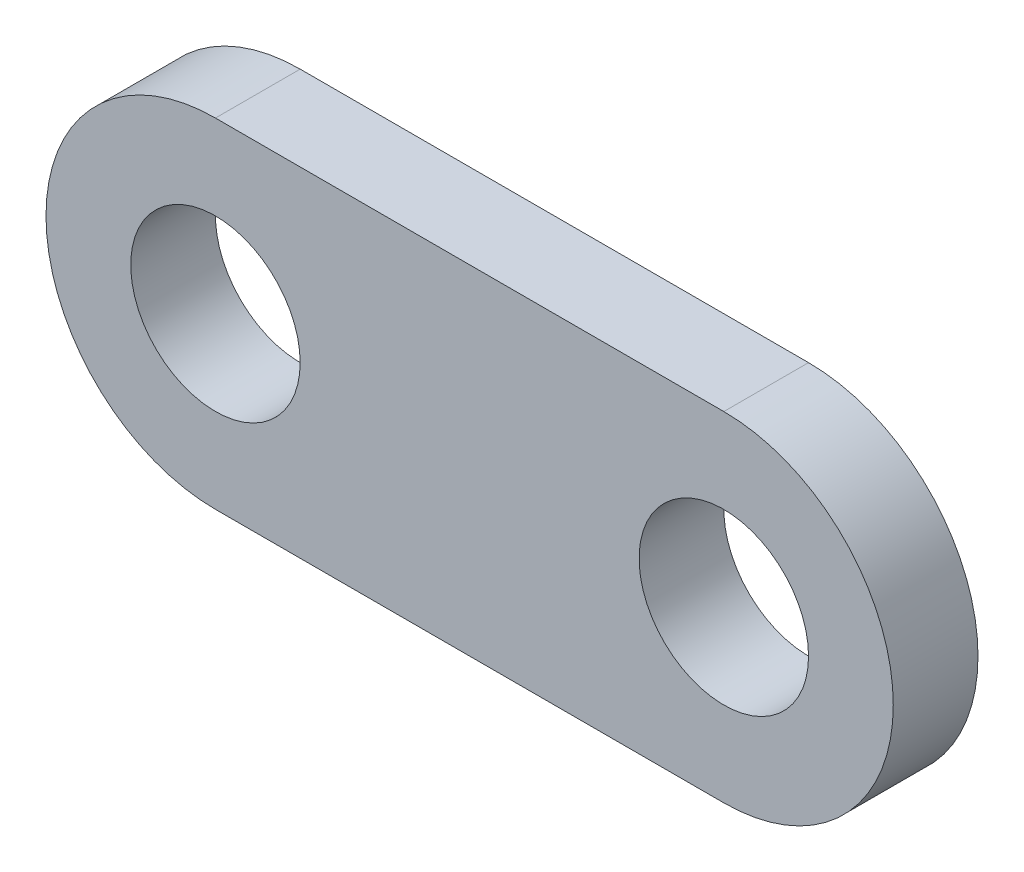
ISO-10303-21;
HEADER;
FILE_DESCRIPTION(('STEP AP214'),'2;1');
FILE_NAME('part.step','',(''),(''),'','','');
FILE_SCHEMA(('AUTOMOTIVE_DESIGN { 1 0 10303 214 1 1 1 1 }'));
ENDSEC;
DATA;
#1=APPLICATION_CONTEXT('core data for automotive mechanical design processes');
#2=APPLICATION_PROTOCOL_DEFINITION('international standard','automotive_design',2000,#1);
#3=PRODUCT_CONTEXT('',#1,'mechanical');
#4=PRODUCT('Part','Part','',(#3));
#5=PRODUCT_RELATED_PRODUCT_CATEGORY('part','',(#4));
#6=PRODUCT_DEFINITION_FORMATION('','',#4);
#7=PRODUCT_DEFINITION_CONTEXT('part definition',#1,'design');
#8=PRODUCT_DEFINITION('design','',#6,#7);
#9=PRODUCT_DEFINITION_SHAPE('','',#8);
#10=(LENGTH_UNIT() NAMED_UNIT(*) SI_UNIT(.MILLI.,.METRE.));
#11=(NAMED_UNIT(*) PLANE_ANGLE_UNIT() SI_UNIT($,.RADIAN.));
#12=(NAMED_UNIT(*) SI_UNIT($,.STERADIAN.) SOLID_ANGLE_UNIT());
#13=UNCERTAINTY_MEASURE_WITH_UNIT(LENGTH_MEASURE(1.E-05),#10,'distance_accuracy_value','');
#14=(GEOMETRIC_REPRESENTATION_CONTEXT(3) GLOBAL_UNCERTAINTY_ASSIGNED_CONTEXT((#13)) GLOBAL_UNIT_ASSIGNED_CONTEXT((#10,
#11,#12)) REPRESENTATION_CONTEXT('',''));
#15=CARTESIAN_POINT('',(0.,0.,0.));
#16=DIRECTION('',(0.,0.,1.));
#17=DIRECTION('',(1.,0.,0.));
#18=AXIS2_PLACEMENT_3D('',#15,#16,#17);
#19=CARTESIAN_POINT('',(0.,-9.99999999999999,5.));
#20=DIRECTION('',(0.,1.,0.));
#21=DIRECTION('',(0.,0.,1.));
#22=AXIS2_PLACEMENT_3D('',#19,#20,#21);
#23=PLANE('',#22);
#24=DIRECTION('',(1.,0.,0.));
#25=VECTOR('',#24,1.);
#26=CARTESIAN_POINT('',(0.,-9.99999999999999,0.));
#27=LINE('',#26,#25);
#28=CARTESIAN_POINT('',(0.,-9.99999999999999,0.));
#29=VERTEX_POINT('',#28);
#30=CARTESIAN_POINT('',(30.,-9.99999999999999,0.));
#31=VERTEX_POINT('',#30);
#32=EDGE_CURVE('E104',#29,#31,#27,.T.);
#33=ORIENTED_EDGE('',*,*,#32,.T.);
#34=DIRECTION('',(0.,0.,-1.));
#35=VECTOR('',#34,1.);
#36=CARTESIAN_POINT('',(30.,-9.99999999999999,5.));
#37=LINE('',#36,#35);
#38=CARTESIAN_POINT('',(30.,-9.99999999999999,5.));
#39=VERTEX_POINT('',#38);
#40=EDGE_CURVE('E11',#39,#31,#37,.T.);
#41=ORIENTED_EDGE('',*,*,#40,.F.);
#42=DIRECTION('',(1.,0.,0.));
#43=VECTOR('',#42,1.);
#44=CARTESIAN_POINT('',(0.,-9.99999999999999,5.));
#45=LINE('',#44,#43);
#46=CARTESIAN_POINT('',(0.,-9.99999999999999,5.));
#47=VERTEX_POINT('',#46);
#48=EDGE_CURVE('E83',#47,#39,#45,.T.);
#49=ORIENTED_EDGE('',*,*,#48,.F.);
#50=DIRECTION('',(0.,0.,-1.));
#51=VECTOR('',#50,1.);
#52=CARTESIAN_POINT('',(0.,-9.99999999999999,5.));
#53=LINE('',#52,#51);
#54=EDGE_CURVE('E94',#47,#29,#53,.T.);
#55=ORIENTED_EDGE('',*,*,#54,.T.);
#56=EDGE_LOOP('',(#33,#41,#49,#55));
#57=FACE_BOUND('',#56,.T.);
#58=ADVANCED_FACE('F35',(#57),#23,.F.);
#59=CARTESIAN_POINT('',(30.,0.,5.));
#60=DIRECTION('',(0.,0.,-1.));
#61=DIRECTION('',(-1.,0.,0.));
#62=AXIS2_PLACEMENT_3D('',#59,#60,#61);
#63=CYLINDRICAL_SURFACE('',#62,10.);
#64=CARTESIAN_POINT('',(30.,0.,0.));
#65=DIRECTION('',(0.,0.,1.));
#66=DIRECTION('',(1.,0.,0.));
#67=AXIS2_PLACEMENT_3D('',#64,#65,#66);
#68=CIRCLE('',#67,10.);
#69=CARTESIAN_POINT('',(30.,10.,0.));
#70=VERTEX_POINT('',#69);
#71=EDGE_CURVE('E88',#31,#70,#68,.T.);
#72=ORIENTED_EDGE('',*,*,#71,.T.);
#73=DIRECTION('',(0.,0.,-1.));
#74=VECTOR('',#73,1.);
#75=CARTESIAN_POINT('',(30.,10.,5.));
#76=LINE('',#75,#74);
#77=CARTESIAN_POINT('',(30.,10.,5.));
#78=VERTEX_POINT('',#77);
#79=EDGE_CURVE('E44',#78,#70,#76,.T.);
#80=ORIENTED_EDGE('',*,*,#79,.F.);
#81=CARTESIAN_POINT('',(30.,0.,5.));
#82=DIRECTION('',(0.,0.,1.));
#83=DIRECTION('',(1.,0.,0.));
#84=AXIS2_PLACEMENT_3D('',#81,#82,#83);
#85=CIRCLE('',#84,10.);
#86=EDGE_CURVE('E78',#39,#78,#85,.T.);
#87=ORIENTED_EDGE('',*,*,#86,.F.);
#88=ORIENTED_EDGE('',*,*,#40,.T.);
#89=EDGE_LOOP('',(#72,#80,#87,#88));
#90=FACE_BOUND('',#89,.T.);
#91=ADVANCED_FACE('F87',(#90),#63,.T.);
#92=CARTESIAN_POINT('',(0.,10.,5.));
#93=DIRECTION('',(0.,1.,0.));
#94=DIRECTION('',(0.,0.,1.));
#95=AXIS2_PLACEMENT_3D('',#92,#93,#94);
#96=PLANE('',#95);
#97=DIRECTION('',(1.,0.,0.));
#98=VECTOR('',#97,1.);
#99=CARTESIAN_POINT('',(0.,10.,0.));
#100=LINE('',#99,#98);
#101=CARTESIAN_POINT('',(0.,10.,0.));
#102=VERTEX_POINT('',#101);
#103=EDGE_CURVE('E108',#102,#70,#100,.T.);
#104=ORIENTED_EDGE('',*,*,#103,.F.);
#105=DIRECTION('',(0.,0.,-1.));
#106=VECTOR('',#105,1.);
#107=CARTESIAN_POINT('',(0.,10.,5.));
#108=LINE('',#107,#106);
#109=CARTESIAN_POINT('',(0.,10.,5.));
#110=VERTEX_POINT('',#109);
#111=EDGE_CURVE('E68',#110,#102,#108,.T.);
#112=ORIENTED_EDGE('',*,*,#111,.F.);
#113=DIRECTION('',(1.,0.,0.));
#114=VECTOR('',#113,1.);
#115=CARTESIAN_POINT('',(0.,10.,5.));
#116=LINE('',#115,#114);
#117=EDGE_CURVE('E81',#110,#78,#116,.T.);
#118=ORIENTED_EDGE('',*,*,#117,.T.);
#119=ORIENTED_EDGE('',*,*,#79,.T.);
#120=EDGE_LOOP('',(#104,#112,#118,#119));
#121=FACE_BOUND('',#120,.T.);
#122=ADVANCED_FACE('F92',(#121),#96,.T.);
#123=CARTESIAN_POINT('',(0.,0.,5.));
#124=DIRECTION('',(0.,0.,-1.));
#125=DIRECTION('',(-1.,0.,0.));
#126=AXIS2_PLACEMENT_3D('',#123,#124,#125);
#127=CYLINDRICAL_SURFACE('',#126,5.);
#128=CARTESIAN_POINT('',(0.,0.,5.));
#129=DIRECTION('',(0.,0.,1.));
#130=DIRECTION('',(1.,0.,0.));
#131=AXIS2_PLACEMENT_3D('',#128,#129,#130);
#132=CIRCLE('',#131,5.);
#133=CARTESIAN_POINT('',(5.,0.,5.));
#134=VERTEX_POINT('',#133);
#135=EDGE_CURVE('E146',#134,#134,#132,.T.);
#136=ORIENTED_EDGE('',*,*,#135,.T.);
#137=EDGE_LOOP('',(#136));
#138=FACE_BOUND('',#137,.T.);
#139=CARTESIAN_POINT('',(0.,0.,0.));
#140=DIRECTION('',(0.,0.,1.));
#141=DIRECTION('',(1.,0.,0.));
#142=AXIS2_PLACEMENT_3D('',#139,#140,#141);
#143=CIRCLE('',#142,5.);
#144=CARTESIAN_POINT('',(5.,0.,0.));
#145=VERTEX_POINT('',#144);
#146=EDGE_CURVE('E101',#145,#145,#143,.T.);
#147=ORIENTED_EDGE('',*,*,#146,.F.);
#148=EDGE_LOOP('',(#147));
#149=FACE_BOUND('',#148,.T.);
#150=ADVANCED_FACE('F135',(#138,#149),#127,.F.);
#151=CARTESIAN_POINT('',(30.,0.,5.));
#152=DIRECTION('',(0.,0.,-1.));
#153=DIRECTION('',(-1.,0.,0.));
#154=AXIS2_PLACEMENT_3D('',#151,#152,#153);
#155=CYLINDRICAL_SURFACE('',#154,5.);
#156=CARTESIAN_POINT('',(30.,0.,5.));
#157=DIRECTION('',(0.,0.,1.));
#158=DIRECTION('',(1.,0.,0.));
#159=AXIS2_PLACEMENT_3D('',#156,#157,#158);
#160=CIRCLE('',#159,5.);
#161=CARTESIAN_POINT('',(35.,0.,5.));
#162=VERTEX_POINT('',#161);
#163=EDGE_CURVE('E111',#162,#162,#160,.T.);
#164=ORIENTED_EDGE('',*,*,#163,.T.);
#165=EDGE_LOOP('',(#164));
#166=FACE_BOUND('',#165,.T.);
#167=CARTESIAN_POINT('',(30.,0.,0.));
#168=DIRECTION('',(0.,0.,1.));
#169=DIRECTION('',(1.,0.,0.));
#170=AXIS2_PLACEMENT_3D('',#167,#168,#169);
#171=CIRCLE('',#170,5.);
#172=CARTESIAN_POINT('',(35.,0.,0.));
#173=VERTEX_POINT('',#172);
#174=EDGE_CURVE('E98',#173,#173,#171,.T.);
#175=ORIENTED_EDGE('',*,*,#174,.F.);
#176=EDGE_LOOP('',(#175));
#177=FACE_BOUND('',#176,.T.);
#178=ADVANCED_FACE('F37',(#166,#177),#155,.F.);
#179=CARTESIAN_POINT('',(0.,0.,5.));
#180=DIRECTION('',(0.,0.,-1.));
#181=DIRECTION('',(-1.,0.,0.));
#182=AXIS2_PLACEMENT_3D('',#179,#180,#181);
#183=CYLINDRICAL_SURFACE('',#182,10.);
#184=CARTESIAN_POINT('',(0.,0.,0.));
#185=DIRECTION('',(0.,0.,1.));
#186=DIRECTION('',(1.,0.,0.));
#187=AXIS2_PLACEMENT_3D('',#184,#185,#186);
#188=CIRCLE('',#187,10.);
#189=EDGE_CURVE('E71',#102,#29,#188,.T.);
#190=ORIENTED_EDGE('',*,*,#189,.T.);
#191=ORIENTED_EDGE('',*,*,#54,.F.);
#192=CARTESIAN_POINT('',(0.,0.,5.));
#193=DIRECTION('',(0.,0.,1.));
#194=DIRECTION('',(1.,0.,0.));
#195=AXIS2_PLACEMENT_3D('',#192,#193,#194);
#196=CIRCLE('',#195,10.);
#197=EDGE_CURVE('E52',#110,#47,#196,.T.);
#198=ORIENTED_EDGE('',*,*,#197,.F.);
#199=ORIENTED_EDGE('',*,*,#111,.T.);
#200=EDGE_LOOP('',(#190,#191,#198,#199));
#201=FACE_BOUND('',#200,.T.);
#202=ADVANCED_FACE('F123',(#201),#183,.T.);
#203=CARTESIAN_POINT('',(0.,0.,5.));
#204=DIRECTION('',(0.,0.,1.));
#205=DIRECTION('',(1.,0.,0.));
#206=AXIS2_PLACEMENT_3D('',#203,#204,#205);
#207=PLANE('',#206);
#208=ORIENTED_EDGE('',*,*,#163,.F.);
#209=EDGE_LOOP('',(#208));
#210=FACE_BOUND('',#209,.T.);
#211=ORIENTED_EDGE('',*,*,#135,.F.);
#212=EDGE_LOOP('',(#211));
#213=FACE_BOUND('',#212,.T.);
#214=ORIENTED_EDGE('',*,*,#48,.T.);
#215=ORIENTED_EDGE('',*,*,#86,.T.);
#216=ORIENTED_EDGE('',*,*,#117,.F.);
#217=ORIENTED_EDGE('',*,*,#197,.T.);
#218=EDGE_LOOP('',(#214,#215,#216,#217));
#219=FACE_BOUND('',#218,.T.);
#220=ADVANCED_FACE('F79',(#210,#213,#219),#207,.T.);
#221=CARTESIAN_POINT('',(0.,0.,0.));
#222=DIRECTION('',(0.,0.,1.));
#223=DIRECTION('',(1.,0.,0.));
#224=AXIS2_PLACEMENT_3D('',#221,#222,#223);
#225=PLANE('',#224);
#226=ORIENTED_EDGE('',*,*,#174,.T.);
#227=EDGE_LOOP('',(#226));
#228=FACE_BOUND('',#227,.T.);
#229=ORIENTED_EDGE('',*,*,#146,.T.);
#230=EDGE_LOOP('',(#229));
#231=FACE_BOUND('',#230,.T.);
#232=ORIENTED_EDGE('',*,*,#32,.F.);
#233=ORIENTED_EDGE('',*,*,#189,.F.);
#234=ORIENTED_EDGE('',*,*,#103,.T.);
#235=ORIENTED_EDGE('',*,*,#71,.F.);
#236=EDGE_LOOP('',(#232,#233,#234,#235));
#237=FACE_BOUND('',#236,.T.);
#238=ADVANCED_FACE('F116',(#228,#231,#237),#225,.F.);
#239=CLOSED_SHELL('',(#58,#91,#122,#150,#178,#202,#220,#238));
#240=MANIFOLD_SOLID_BREP('B2',#239);
#241=ADVANCED_BREP_SHAPE_REPRESENTATION('',(#18,#240),#14);
#242=SHAPE_DEFINITION_REPRESENTATION(#9,#241);
ENDSEC;
END-ISO-10303-21;
